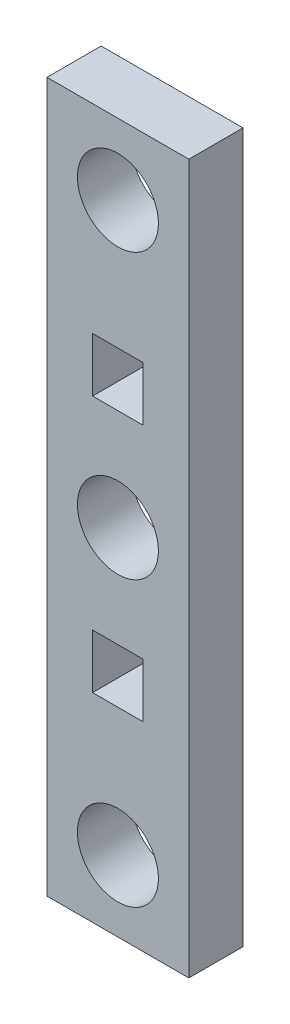
ISO-10303-21;
HEADER;
FILE_DESCRIPTION(('STEP AP214'),'2;1');
FILE_NAME('part.step','',(''),(''),'','','');
FILE_SCHEMA(('AUTOMOTIVE_DESIGN { 1 0 10303 214 1 1 1 1 }'));
ENDSEC;
DATA;
#1=APPLICATION_CONTEXT('core data for automotive mechanical design processes');
#2=APPLICATION_PROTOCOL_DEFINITION('international standard','automotive_design',2000,#1);
#3=PRODUCT_CONTEXT('',#1,'mechanical');
#4=PRODUCT('Part','Part','',(#3));
#5=PRODUCT_RELATED_PRODUCT_CATEGORY('part','',(#4));
#6=PRODUCT_DEFINITION_FORMATION('','',#4);
#7=PRODUCT_DEFINITION_CONTEXT('part definition',#1,'design');
#8=PRODUCT_DEFINITION('design','',#6,#7);
#9=PRODUCT_DEFINITION_SHAPE('','',#8);
#10=(LENGTH_UNIT() NAMED_UNIT(*) SI_UNIT(.MILLI.,.METRE.));
#11=(NAMED_UNIT(*) PLANE_ANGLE_UNIT() SI_UNIT($,.RADIAN.));
#12=(NAMED_UNIT(*) SI_UNIT($,.STERADIAN.) SOLID_ANGLE_UNIT());
#13=UNCERTAINTY_MEASURE_WITH_UNIT(LENGTH_MEASURE(1.E-05),#10,'distance_accuracy_value','');
#14=(GEOMETRIC_REPRESENTATION_CONTEXT(3) GLOBAL_UNCERTAINTY_ASSIGNED_CONTEXT((#13)) GLOBAL_UNIT_ASSIGNED_CONTEXT((#10,
#11,#12)) REPRESENTATION_CONTEXT('',''));
#15=CARTESIAN_POINT('',(0.,0.,0.));
#16=DIRECTION('',(0.,0.,1.));
#17=DIRECTION('',(1.,0.,0.));
#18=AXIS2_PLACEMENT_3D('',#15,#16,#17);
#19=CARTESIAN_POINT('',(0.,0.,5.35));
#20=DIRECTION('',(0.,0.,1.));
#21=DIRECTION('',(1.,0.,0.));
#22=AXIS2_PLACEMENT_3D('',#19,#20,#21);
#23=PLANE('',#22);
#24=CARTESIAN_POINT('',(7.00000000000001,35.,5.35));
#25=DIRECTION('',(0.,0.,1.));
#26=DIRECTION('',(1.,0.,0.));
#27=AXIS2_PLACEMENT_3D('',#24,#25,#26);
#28=CIRCLE('',#27,4.);
#29=CARTESIAN_POINT('',(11.,35.,5.35));
#30=VERTEX_POINT('',#29);
#31=EDGE_CURVE('E195',#30,#30,#28,.T.);
#32=ORIENTED_EDGE('',*,*,#31,.F.);
#33=EDGE_LOOP('',(#32));
#34=FACE_BOUND('',#33,.T.);
#35=DIRECTION('',(0.,-1.,0.));
#36=VECTOR('',#35,1.);
#37=CARTESIAN_POINT('',(0.,70.000000298,5.35));
#38=LINE('',#37,#36);
#39=CARTESIAN_POINT('',(0.,70.000000298,5.35));
#40=VERTEX_POINT('',#39);
#41=CARTESIAN_POINT('',(0.,0.,5.35));
#42=VERTEX_POINT('',#41);
#43=EDGE_CURVE('E207',#40,#42,#38,.T.);
#44=ORIENTED_EDGE('',*,*,#43,.T.);
#45=DIRECTION('',(1.,0.,0.));
#46=VECTOR('',#45,1.);
#47=CARTESIAN_POINT('',(0.,0.,5.35));
#48=LINE('',#47,#46);
#49=CARTESIAN_POINT('',(14.0000004322,0.,5.35));
#50=VERTEX_POINT('',#49);
#51=EDGE_CURVE('E210',#42,#50,#48,.T.);
#52=ORIENTED_EDGE('',*,*,#51,.T.);
#53=DIRECTION('',(0.,1.,0.));
#54=VECTOR('',#53,1.);
#55=CARTESIAN_POINT('',(14.0000004322,0.,5.35));
#56=LINE('',#55,#54);
#57=CARTESIAN_POINT('',(14.0000004322,70.000000298,5.35));
#58=VERTEX_POINT('',#57);
#59=EDGE_CURVE('E213',#50,#58,#56,.T.);
#60=ORIENTED_EDGE('',*,*,#59,.T.);
#61=DIRECTION('',(-1.,0.,0.));
#62=VECTOR('',#61,1.);
#63=CARTESIAN_POINT('',(14.0000004322,70.000000298,5.35));
#64=LINE('',#63,#62);
#65=EDGE_CURVE('E215',#58,#40,#64,.T.);
#66=ORIENTED_EDGE('',*,*,#65,.T.);
#67=EDGE_LOOP('',(#44,#52,#60,#66));
#68=FACE_BOUND('',#67,.T.);
#69=CARTESIAN_POINT('',(7.00000000000001,63.,5.35));
#70=DIRECTION('',(0.,0.,1.));
#71=DIRECTION('',(1.,0.,0.));
#72=AXIS2_PLACEMENT_3D('',#69,#70,#71);
#73=CIRCLE('',#72,4.);
#74=CARTESIAN_POINT('',(11.,63.,5.35));
#75=VERTEX_POINT('',#74);
#76=EDGE_CURVE('E201',#75,#75,#73,.T.);
#77=ORIENTED_EDGE('',*,*,#76,.F.);
#78=EDGE_LOOP('',(#77));
#79=FACE_BOUND('',#78,.T.);
#80=CARTESIAN_POINT('',(7.00000000000001,7.,5.35));
#81=DIRECTION('',(0.,0.,1.));
#82=DIRECTION('',(1.,0.,0.));
#83=AXIS2_PLACEMENT_3D('',#80,#81,#82);
#84=CIRCLE('',#83,4.);
#85=CARTESIAN_POINT('',(11.,7.,5.35));
#86=VERTEX_POINT('',#85);
#87=EDGE_CURVE('E189',#86,#86,#84,.T.);
#88=ORIENTED_EDGE('',*,*,#87,.F.);
#89=EDGE_LOOP('',(#88));
#90=FACE_BOUND('',#89,.T.);
#91=DIRECTION('',(-1.,0.,0.));
#92=VECTOR('',#91,1.);
#93=CARTESIAN_POINT('',(9.49999969460002,25.0000003725,5.35));
#94=LINE('',#93,#92);
#95=CARTESIAN_POINT('',(9.49999969460002,25.0000003725,5.35));
#96=VERTEX_POINT('',#95);
#97=CARTESIAN_POINT('',(4.49999980630006,25.0000003725,5.35));
#98=VERTEX_POINT('',#97);
#99=EDGE_CURVE('E160',#96,#98,#94,.T.);
#100=ORIENTED_EDGE('',*,*,#99,.F.);
#101=DIRECTION('',(0.,1.,0.));
#102=VECTOR('',#101,1.);
#103=CARTESIAN_POINT('',(9.49999969460002,19.6499992162,5.35));
#104=LINE('',#103,#102);
#105=CARTESIAN_POINT('',(9.49999969460002,19.6499992162,5.35));
#106=VERTEX_POINT('',#105);
#107=EDGE_CURVE('E158',#106,#96,#104,.T.);
#108=ORIENTED_EDGE('',*,*,#107,.F.);
#109=DIRECTION('',(1.,0.,0.));
#110=VECTOR('',#109,1.);
#111=CARTESIAN_POINT('',(4.49999980630006,19.6499992162,5.35));
#112=LINE('',#111,#110);
#113=CARTESIAN_POINT('',(4.49999980630006,19.6499992162,5.35));
#114=VERTEX_POINT('',#113);
#115=EDGE_CURVE('E166',#114,#106,#112,.T.);
#116=ORIENTED_EDGE('',*,*,#115,.F.);
#117=DIRECTION('',(0.,-1.,0.));
#118=VECTOR('',#117,1.);
#119=CARTESIAN_POINT('',(4.49999980630006,25.0000003725,5.35));
#120=LINE('',#119,#118);
#121=EDGE_CURVE('E163',#98,#114,#120,.T.);
#122=ORIENTED_EDGE('',*,*,#121,.F.);
#123=EDGE_LOOP('',(#100,#108,#116,#122));
#124=FACE_BOUND('',#123,.T.);
#125=DIRECTION('',(1.,0.,0.));
#126=VECTOR('',#125,1.);
#127=CARTESIAN_POINT('',(4.49999980630006,45.0000017881,5.35));
#128=LINE('',#127,#126);
#129=CARTESIAN_POINT('',(4.49999980630006,45.0000017881,5.35));
#130=VERTEX_POINT('',#129);
#131=CARTESIAN_POINT('',(9.49999969460002,45.0000017881,5.35));
#132=VERTEX_POINT('',#131);
#133=EDGE_CURVE('E130',#130,#132,#128,.T.);
#134=ORIENTED_EDGE('',*,*,#133,.F.);
#135=DIRECTION('',(0.,-1.,0.));
#136=VECTOR('',#135,1.);
#137=CARTESIAN_POINT('',(4.49999980630006,50.3499992191,5.35));
#138=LINE('',#137,#136);
#139=CARTESIAN_POINT('',(4.49999980630006,50.3499992191,5.35));
#140=VERTEX_POINT('',#139);
#141=EDGE_CURVE('E122',#140,#130,#138,.T.);
#142=ORIENTED_EDGE('',*,*,#141,.F.);
#143=DIRECTION('',(-1.,0.,0.));
#144=VECTOR('',#143,1.);
#145=CARTESIAN_POINT('',(9.49999969460002,50.3499992191,5.35));
#146=LINE('',#145,#144);
#147=CARTESIAN_POINT('',(9.49999969460002,50.3499992191,5.35));
#148=VERTEX_POINT('',#147);
#149=EDGE_CURVE('E144',#148,#140,#146,.T.);
#150=ORIENTED_EDGE('',*,*,#149,.F.);
#151=DIRECTION('',(0.,1.,0.));
#152=VECTOR('',#151,1.);
#153=CARTESIAN_POINT('',(9.49999969460002,45.0000017881,5.35));
#154=LINE('',#153,#152);
#155=EDGE_CURVE('E142',#132,#148,#154,.T.);
#156=ORIENTED_EDGE('',*,*,#155,.F.);
#157=EDGE_LOOP('',(#134,#142,#150,#156));
#158=FACE_BOUND('',#157,.T.);
#159=ADVANCED_FACE('F33',(#34,#68,#79,#90,#124,#158),#23,.T.);
#160=CARTESIAN_POINT('',(0.,0.,0.));
#161=DIRECTION('',(0.,0.,1.));
#162=DIRECTION('',(1.,0.,0.));
#163=AXIS2_PLACEMENT_3D('',#160,#161,#162);
#164=PLANE('',#163);
#165=DIRECTION('',(0.,1.,0.));
#166=VECTOR('',#165,1.);
#167=CARTESIAN_POINT('',(9.49999969460002,19.6499992162,0.));
#168=LINE('',#167,#166);
#169=CARTESIAN_POINT('',(9.49999969460002,19.6499992162,0.));
#170=VERTEX_POINT('',#169);
#171=CARTESIAN_POINT('',(9.49999969460002,25.0000003725,0.));
#172=VERTEX_POINT('',#171);
#173=EDGE_CURVE('E138',#170,#172,#168,.T.);
#174=ORIENTED_EDGE('',*,*,#173,.T.);
#175=DIRECTION('',(-1.,0.,0.));
#176=VECTOR('',#175,1.);
#177=CARTESIAN_POINT('',(9.49999969460002,25.0000003725,0.));
#178=LINE('',#177,#176);
#179=CARTESIAN_POINT('',(4.49999980630006,25.0000003725,0.));
#180=VERTEX_POINT('',#179);
#181=EDGE_CURVE('E171',#172,#180,#178,.T.);
#182=ORIENTED_EDGE('',*,*,#181,.T.);
#183=DIRECTION('',(0.,-1.,0.));
#184=VECTOR('',#183,1.);
#185=CARTESIAN_POINT('',(4.49999980630006,25.0000003725,0.));
#186=LINE('',#185,#184);
#187=CARTESIAN_POINT('',(4.49999980630006,19.6499992162,0.));
#188=VERTEX_POINT('',#187);
#189=EDGE_CURVE('E174',#180,#188,#186,.T.);
#190=ORIENTED_EDGE('',*,*,#189,.T.);
#191=DIRECTION('',(1.,0.,0.));
#192=VECTOR('',#191,1.);
#193=CARTESIAN_POINT('',(4.49999980630006,19.6499992162,0.));
#194=LINE('',#193,#192);
#195=EDGE_CURVE('E161',#188,#170,#194,.T.);
#196=ORIENTED_EDGE('',*,*,#195,.T.);
#197=EDGE_LOOP('',(#174,#182,#190,#196));
#198=FACE_BOUND('',#197,.T.);
#199=DIRECTION('',(0.,-1.,0.));
#200=VECTOR('',#199,1.);
#201=CARTESIAN_POINT('',(0.,70.000000298,0.));
#202=LINE('',#201,#200);
#203=CARTESIAN_POINT('',(0.,70.000000298,0.));
#204=VERTEX_POINT('',#203);
#205=CARTESIAN_POINT('',(0.,0.,0.));
#206=VERTEX_POINT('',#205);
#207=EDGE_CURVE('E204',#204,#206,#202,.T.);
#208=ORIENTED_EDGE('',*,*,#207,.F.);
#209=DIRECTION('',(-1.,0.,0.));
#210=VECTOR('',#209,1.);
#211=CARTESIAN_POINT('',(14.0000004322,70.000000298,0.));
#212=LINE('',#211,#210);
#213=CARTESIAN_POINT('',(14.0000004322,70.000000298,0.));
#214=VERTEX_POINT('',#213);
#215=EDGE_CURVE('E211',#214,#204,#212,.T.);
#216=ORIENTED_EDGE('',*,*,#215,.F.);
#217=DIRECTION('',(0.,1.,0.));
#218=VECTOR('',#217,1.);
#219=CARTESIAN_POINT('',(14.0000004322,0.,0.));
#220=LINE('',#219,#218);
#221=CARTESIAN_POINT('',(14.0000004322,0.,0.));
#222=VERTEX_POINT('',#221);
#223=EDGE_CURVE('E222',#222,#214,#220,.T.);
#224=ORIENTED_EDGE('',*,*,#223,.F.);
#225=DIRECTION('',(1.,0.,0.));
#226=VECTOR('',#225,1.);
#227=CARTESIAN_POINT('',(0.,0.,0.));
#228=LINE('',#227,#226);
#229=EDGE_CURVE('E220',#206,#222,#228,.T.);
#230=ORIENTED_EDGE('',*,*,#229,.F.);
#231=EDGE_LOOP('',(#208,#216,#224,#230));
#232=FACE_BOUND('',#231,.T.);
#233=CARTESIAN_POINT('',(7.00000000000001,63.,0.));
#234=DIRECTION('',(0.,0.,1.));
#235=DIRECTION('',(1.,0.,0.));
#236=AXIS2_PLACEMENT_3D('',#233,#234,#235);
#237=CIRCLE('',#236,4.);
#238=CARTESIAN_POINT('',(11.,63.,0.));
#239=VERTEX_POINT('',#238);
#240=EDGE_CURVE('E198',#239,#239,#237,.T.);
#241=ORIENTED_EDGE('',*,*,#240,.T.);
#242=EDGE_LOOP('',(#241));
#243=FACE_BOUND('',#242,.T.);
#244=CARTESIAN_POINT('',(7.00000000000001,35.,0.));
#245=DIRECTION('',(0.,0.,1.));
#246=DIRECTION('',(1.,0.,0.));
#247=AXIS2_PLACEMENT_3D('',#244,#245,#246);
#248=CIRCLE('',#247,4.);
#249=CARTESIAN_POINT('',(11.,35.,0.));
#250=VERTEX_POINT('',#249);
#251=EDGE_CURVE('E192',#250,#250,#248,.T.);
#252=ORIENTED_EDGE('',*,*,#251,.T.);
#253=EDGE_LOOP('',(#252));
#254=FACE_BOUND('',#253,.T.);
#255=CARTESIAN_POINT('',(7.00000000000001,7.,0.));
#256=DIRECTION('',(0.,0.,1.));
#257=DIRECTION('',(1.,0.,0.));
#258=AXIS2_PLACEMENT_3D('',#255,#256,#257);
#259=CIRCLE('',#258,4.);
#260=CARTESIAN_POINT('',(11.,7.,0.));
#261=VERTEX_POINT('',#260);
#262=EDGE_CURVE('E188',#261,#261,#259,.T.);
#263=ORIENTED_EDGE('',*,*,#262,.T.);
#264=EDGE_LOOP('',(#263));
#265=FACE_BOUND('',#264,.T.);
#266=DIRECTION('',(0.,-1.,0.));
#267=VECTOR('',#266,1.);
#268=CARTESIAN_POINT('',(4.49999980630006,50.3499992191,0.));
#269=LINE('',#268,#267);
#270=CARTESIAN_POINT('',(4.49999980630006,50.3499992191,0.));
#271=VERTEX_POINT('',#270);
#272=CARTESIAN_POINT('',(4.49999980630006,45.0000017881,0.));
#273=VERTEX_POINT('',#272);
#274=EDGE_CURVE('E56',#271,#273,#269,.T.);
#275=ORIENTED_EDGE('',*,*,#274,.T.);
#276=DIRECTION('',(1.,0.,0.));
#277=VECTOR('',#276,1.);
#278=CARTESIAN_POINT('',(4.49999980630006,45.0000017881,0.));
#279=LINE('',#278,#277);
#280=CARTESIAN_POINT('',(9.49999969460002,45.0000017881,0.));
#281=VERTEX_POINT('',#280);
#282=EDGE_CURVE('E137',#273,#281,#279,.T.);
#283=ORIENTED_EDGE('',*,*,#282,.T.);
#284=DIRECTION('',(0.,1.,0.));
#285=VECTOR('',#284,1.);
#286=CARTESIAN_POINT('',(9.49999969460002,45.0000017881,0.));
#287=LINE('',#286,#285);
#288=CARTESIAN_POINT('',(9.49999969460002,50.3499992191,0.));
#289=VERTEX_POINT('',#288);
#290=EDGE_CURVE('E150',#281,#289,#287,.T.);
#291=ORIENTED_EDGE('',*,*,#290,.T.);
#292=DIRECTION('',(-1.,0.,0.));
#293=VECTOR('',#292,1.);
#294=CARTESIAN_POINT('',(9.49999969460002,50.3499992191,0.));
#295=LINE('',#294,#293);
#296=EDGE_CURVE('E131',#289,#271,#295,.T.);
#297=ORIENTED_EDGE('',*,*,#296,.T.);
#298=EDGE_LOOP('',(#275,#283,#291,#297));
#299=FACE_BOUND('',#298,.T.);
#300=ADVANCED_FACE('F240',(#198,#232,#243,#254,#265,#299),#164,.F.);
#301=CARTESIAN_POINT('',(0.,70.000000298,5.35));
#302=DIRECTION('',(1.,0.,0.));
#303=DIRECTION('',(0.,0.,-1.));
#304=AXIS2_PLACEMENT_3D('',#301,#302,#303);
#305=PLANE('',#304);
#306=ORIENTED_EDGE('',*,*,#207,.T.);
#307=DIRECTION('',(0.,0.,-1.));
#308=VECTOR('',#307,1.);
#309=CARTESIAN_POINT('',(0.,0.,5.35));
#310=LINE('',#309,#308);
#311=EDGE_CURVE('E11',#42,#206,#310,.T.);
#312=ORIENTED_EDGE('',*,*,#311,.F.);
#313=ORIENTED_EDGE('',*,*,#43,.F.);
#314=DIRECTION('',(0.,0.,-1.));
#315=VECTOR('',#314,1.);
#316=CARTESIAN_POINT('',(0.,70.000000298,5.35));
#317=LINE('',#316,#315);
#318=EDGE_CURVE('E217',#40,#204,#317,.T.);
#319=ORIENTED_EDGE('',*,*,#318,.T.);
#320=EDGE_LOOP('',(#306,#312,#313,#319));
#321=FACE_BOUND('',#320,.T.);
#322=ADVANCED_FACE('F35',(#321),#305,.F.);
#323=CARTESIAN_POINT('',(0.,0.,5.35));
#324=DIRECTION('',(0.,1.,0.));
#325=DIRECTION('',(0.,0.,1.));
#326=AXIS2_PLACEMENT_3D('',#323,#324,#325);
#327=PLANE('',#326);
#328=ORIENTED_EDGE('',*,*,#229,.T.);
#329=DIRECTION('',(0.,0.,-1.));
#330=VECTOR('',#329,1.);
#331=CARTESIAN_POINT('',(14.0000004322,0.,5.35));
#332=LINE('',#331,#330);
#333=EDGE_CURVE('E41',#50,#222,#332,.T.);
#334=ORIENTED_EDGE('',*,*,#333,.F.);
#335=ORIENTED_EDGE('',*,*,#51,.F.);
#336=ORIENTED_EDGE('',*,*,#311,.T.);
#337=EDGE_LOOP('',(#328,#334,#335,#336));
#338=FACE_BOUND('',#337,.T.);
#339=ADVANCED_FACE('F251',(#338),#327,.F.);
#340=CARTESIAN_POINT('',(14.0000004322,0.,5.35));
#341=DIRECTION('',(-1.,0.,0.));
#342=DIRECTION('',(0.,0.,1.));
#343=AXIS2_PLACEMENT_3D('',#340,#341,#342);
#344=PLANE('',#343);
#345=ORIENTED_EDGE('',*,*,#223,.T.);
#346=DIRECTION('',(0.,0.,-1.));
#347=VECTOR('',#346,1.);
#348=CARTESIAN_POINT('',(14.0000004322,70.000000298,5.35));
#349=LINE('',#348,#347);
#350=EDGE_CURVE('E227',#58,#214,#349,.T.);
#351=ORIENTED_EDGE('',*,*,#350,.F.);
#352=ORIENTED_EDGE('',*,*,#59,.F.);
#353=ORIENTED_EDGE('',*,*,#333,.T.);
#354=EDGE_LOOP('',(#345,#351,#352,#353));
#355=FACE_BOUND('',#354,.T.);
#356=ADVANCED_FACE('F234',(#355),#344,.F.);
#357=CARTESIAN_POINT('',(14.0000004322,70.000000298,5.35));
#358=DIRECTION('',(0.,-1.,0.));
#359=DIRECTION('',(0.,0.,-1.));
#360=AXIS2_PLACEMENT_3D('',#357,#358,#359);
#361=PLANE('',#360);
#362=ORIENTED_EDGE('',*,*,#215,.T.);
#363=ORIENTED_EDGE('',*,*,#318,.F.);
#364=ORIENTED_EDGE('',*,*,#65,.F.);
#365=ORIENTED_EDGE('',*,*,#350,.T.);
#366=EDGE_LOOP('',(#362,#363,#364,#365));
#367=FACE_BOUND('',#366,.T.);
#368=ADVANCED_FACE('F244',(#367),#361,.F.);
#369=CARTESIAN_POINT('',(7.00000000000001,63.,5.35));
#370=DIRECTION('',(0.,0.,-1.));
#371=DIRECTION('',(-1.,0.,0.));
#372=AXIS2_PLACEMENT_3D('',#369,#370,#371);
#373=CYLINDRICAL_SURFACE('',#372,4.);
#374=ORIENTED_EDGE('',*,*,#76,.T.);
#375=EDGE_LOOP('',(#374));
#376=FACE_BOUND('',#375,.T.);
#377=ORIENTED_EDGE('',*,*,#240,.F.);
#378=EDGE_LOOP('',(#377));
#379=FACE_BOUND('',#378,.T.);
#380=ADVANCED_FACE('F268',(#376,#379),#373,.F.);
#381=CARTESIAN_POINT('',(7.00000000000001,35.,5.35));
#382=DIRECTION('',(0.,0.,-1.));
#383=DIRECTION('',(-1.,0.,0.));
#384=AXIS2_PLACEMENT_3D('',#381,#382,#383);
#385=CYLINDRICAL_SURFACE('',#384,4.);
#386=ORIENTED_EDGE('',*,*,#31,.T.);
#387=EDGE_LOOP('',(#386));
#388=FACE_BOUND('',#387,.T.);
#389=ORIENTED_EDGE('',*,*,#251,.F.);
#390=EDGE_LOOP('',(#389));
#391=FACE_BOUND('',#390,.T.);
#392=ADVANCED_FACE('F275',(#388,#391),#385,.F.);
#393=CARTESIAN_POINT('',(7.00000000000001,7.,5.35));
#394=DIRECTION('',(0.,0.,-1.));
#395=DIRECTION('',(-1.,0.,0.));
#396=AXIS2_PLACEMENT_3D('',#393,#394,#395);
#397=CYLINDRICAL_SURFACE('',#396,4.);
#398=ORIENTED_EDGE('',*,*,#87,.T.);
#399=EDGE_LOOP('',(#398));
#400=FACE_BOUND('',#399,.T.);
#401=ORIENTED_EDGE('',*,*,#262,.F.);
#402=EDGE_LOOP('',(#401));
#403=FACE_BOUND('',#402,.T.);
#404=ADVANCED_FACE('F280',(#400,#403),#397,.F.);
#405=CARTESIAN_POINT('',(9.49999969460002,19.6499992162,5.35));
#406=DIRECTION('',(-1.,0.,0.));
#407=DIRECTION('',(0.,0.,1.));
#408=AXIS2_PLACEMENT_3D('',#405,#406,#407);
#409=PLANE('',#408);
#410=ORIENTED_EDGE('',*,*,#173,.F.);
#411=DIRECTION('',(0.,0.,-1.));
#412=VECTOR('',#411,1.);
#413=CARTESIAN_POINT('',(9.49999969460002,19.6499992162,5.35));
#414=LINE('',#413,#412);
#415=EDGE_CURVE('E168',#106,#170,#414,.T.);
#416=ORIENTED_EDGE('',*,*,#415,.F.);
#417=ORIENTED_EDGE('',*,*,#107,.T.);
#418=DIRECTION('',(0.,0.,-1.));
#419=VECTOR('',#418,1.);
#420=CARTESIAN_POINT('',(9.49999969460002,25.0000003725,5.35));
#421=LINE('',#420,#419);
#422=EDGE_CURVE('E185',#96,#172,#421,.T.);
#423=ORIENTED_EDGE('',*,*,#422,.T.);
#424=EDGE_LOOP('',(#410,#416,#417,#423));
#425=FACE_BOUND('',#424,.T.);
#426=ADVANCED_FACE('F316',(#425),#409,.T.);
#427=CARTESIAN_POINT('',(9.49999969460002,25.0000003725,5.35));
#428=DIRECTION('',(0.,-1.,0.));
#429=DIRECTION('',(0.,0.,-1.));
#430=AXIS2_PLACEMENT_3D('',#427,#428,#429);
#431=PLANE('',#430);
#432=ORIENTED_EDGE('',*,*,#181,.F.);
#433=ORIENTED_EDGE('',*,*,#422,.F.);
#434=ORIENTED_EDGE('',*,*,#99,.T.);
#435=DIRECTION('',(0.,0.,-1.));
#436=VECTOR('',#435,1.);
#437=CARTESIAN_POINT('',(4.49999980630006,25.0000003725,5.35));
#438=LINE('',#437,#436);
#439=EDGE_CURVE('E183',#98,#180,#438,.T.);
#440=ORIENTED_EDGE('',*,*,#439,.T.);
#441=EDGE_LOOP('',(#432,#433,#434,#440));
#442=FACE_BOUND('',#441,.T.);
#443=ADVANCED_FACE('F312',(#442),#431,.T.);
#444=CARTESIAN_POINT('',(4.49999980630006,25.0000003725,5.35));
#445=DIRECTION('',(1.,0.,0.));
#446=DIRECTION('',(0.,0.,-1.));
#447=AXIS2_PLACEMENT_3D('',#444,#445,#446);
#448=PLANE('',#447);
#449=ORIENTED_EDGE('',*,*,#189,.F.);
#450=ORIENTED_EDGE('',*,*,#439,.F.);
#451=ORIENTED_EDGE('',*,*,#121,.T.);
#452=DIRECTION('',(0.,0.,-1.));
#453=VECTOR('',#452,1.);
#454=CARTESIAN_POINT('',(4.49999980630006,19.6499992162,5.35));
#455=LINE('',#454,#453);
#456=EDGE_CURVE('E181',#114,#188,#455,.T.);
#457=ORIENTED_EDGE('',*,*,#456,.T.);
#458=EDGE_LOOP('',(#449,#450,#451,#457));
#459=FACE_BOUND('',#458,.T.);
#460=ADVANCED_FACE('F308',(#459),#448,.T.);
#461=CARTESIAN_POINT('',(4.49999980630006,19.6499992162,5.35));
#462=DIRECTION('',(0.,1.,0.));
#463=DIRECTION('',(0.,0.,1.));
#464=AXIS2_PLACEMENT_3D('',#461,#462,#463);
#465=PLANE('',#464);
#466=ORIENTED_EDGE('',*,*,#195,.F.);
#467=ORIENTED_EDGE('',*,*,#456,.F.);
#468=ORIENTED_EDGE('',*,*,#115,.T.);
#469=ORIENTED_EDGE('',*,*,#415,.T.);
#470=EDGE_LOOP('',(#466,#467,#468,#469));
#471=FACE_BOUND('',#470,.T.);
#472=ADVANCED_FACE('F305',(#471),#465,.T.);
#473=CARTESIAN_POINT('',(4.49999980630006,50.3499992191,5.35));
#474=DIRECTION('',(1.,0.,0.));
#475=DIRECTION('',(0.,0.,-1.));
#476=AXIS2_PLACEMENT_3D('',#473,#474,#475);
#477=PLANE('',#476);
#478=ORIENTED_EDGE('',*,*,#274,.F.);
#479=DIRECTION('',(0.,0.,-1.));
#480=VECTOR('',#479,1.);
#481=CARTESIAN_POINT('',(4.49999980630006,50.3499992191,5.35));
#482=LINE('',#481,#480);
#483=EDGE_CURVE('E126',#140,#271,#482,.T.);
#484=ORIENTED_EDGE('',*,*,#483,.F.);
#485=ORIENTED_EDGE('',*,*,#141,.T.);
#486=DIRECTION('',(0.,0.,-1.));
#487=VECTOR('',#486,1.);
#488=CARTESIAN_POINT('',(4.49999980630006,45.0000017881,5.35));
#489=LINE('',#488,#487);
#490=EDGE_CURVE('E125',#130,#273,#489,.T.);
#491=ORIENTED_EDGE('',*,*,#490,.T.);
#492=EDGE_LOOP('',(#478,#484,#485,#491));
#493=FACE_BOUND('',#492,.T.);
#494=ADVANCED_FACE('F124',(#493),#477,.T.);
#495=CARTESIAN_POINT('',(4.49999980630006,45.0000017881,5.35));
#496=DIRECTION('',(0.,1.,0.));
#497=DIRECTION('',(0.,0.,1.));
#498=AXIS2_PLACEMENT_3D('',#495,#496,#497);
#499=PLANE('',#498);
#500=ORIENTED_EDGE('',*,*,#282,.F.);
#501=ORIENTED_EDGE('',*,*,#490,.F.);
#502=ORIENTED_EDGE('',*,*,#133,.T.);
#503=DIRECTION('',(0.,0.,-1.));
#504=VECTOR('',#503,1.);
#505=CARTESIAN_POINT('',(9.49999969460002,45.0000017881,5.35));
#506=LINE('',#505,#504);
#507=EDGE_CURVE('E139',#132,#281,#506,.T.);
#508=ORIENTED_EDGE('',*,*,#507,.T.);
#509=EDGE_LOOP('',(#500,#501,#502,#508));
#510=FACE_BOUND('',#509,.T.);
#511=ADVANCED_FACE('F134',(#510),#499,.T.);
#512=CARTESIAN_POINT('',(9.49999969460002,45.0000017881,5.35));
#513=DIRECTION('',(-1.,0.,0.));
#514=DIRECTION('',(0.,0.,1.));
#515=AXIS2_PLACEMENT_3D('',#512,#513,#514);
#516=PLANE('',#515);
#517=ORIENTED_EDGE('',*,*,#290,.F.);
#518=ORIENTED_EDGE('',*,*,#507,.F.);
#519=ORIENTED_EDGE('',*,*,#155,.T.);
#520=DIRECTION('',(0.,0.,-1.));
#521=VECTOR('',#520,1.);
#522=CARTESIAN_POINT('',(9.49999969460002,50.3499992191,5.35));
#523=LINE('',#522,#521);
#524=EDGE_CURVE('E48',#148,#289,#523,.T.);
#525=ORIENTED_EDGE('',*,*,#524,.T.);
#526=EDGE_LOOP('',(#517,#518,#519,#525));
#527=FACE_BOUND('',#526,.T.);
#528=ADVANCED_FACE('F293',(#527),#516,.T.);
#529=CARTESIAN_POINT('',(9.49999969460002,50.3499992191,5.35));
#530=DIRECTION('',(0.,-1.,0.));
#531=DIRECTION('',(0.,0.,-1.));
#532=AXIS2_PLACEMENT_3D('',#529,#530,#531);
#533=PLANE('',#532);
#534=ORIENTED_EDGE('',*,*,#296,.F.);
#535=ORIENTED_EDGE('',*,*,#524,.F.);
#536=ORIENTED_EDGE('',*,*,#149,.T.);
#537=ORIENTED_EDGE('',*,*,#483,.T.);
#538=EDGE_LOOP('',(#534,#535,#536,#537));
#539=FACE_BOUND('',#538,.T.);
#540=ADVANCED_FACE('F291',(#539),#533,.T.);
#541=CLOSED_SHELL('',(#159,#300,#322,#339,#356,#368,#380,#392,#404,#426,#443,#460,#472,#494,
#511,#528,#540));
#542=MANIFOLD_SOLID_BREP('B2',#541);
#543=ADVANCED_BREP_SHAPE_REPRESENTATION('',(#18,#542),#14);
#544=SHAPE_DEFINITION_REPRESENTATION(#9,#543);
ENDSEC;
END-ISO-10303-21;
